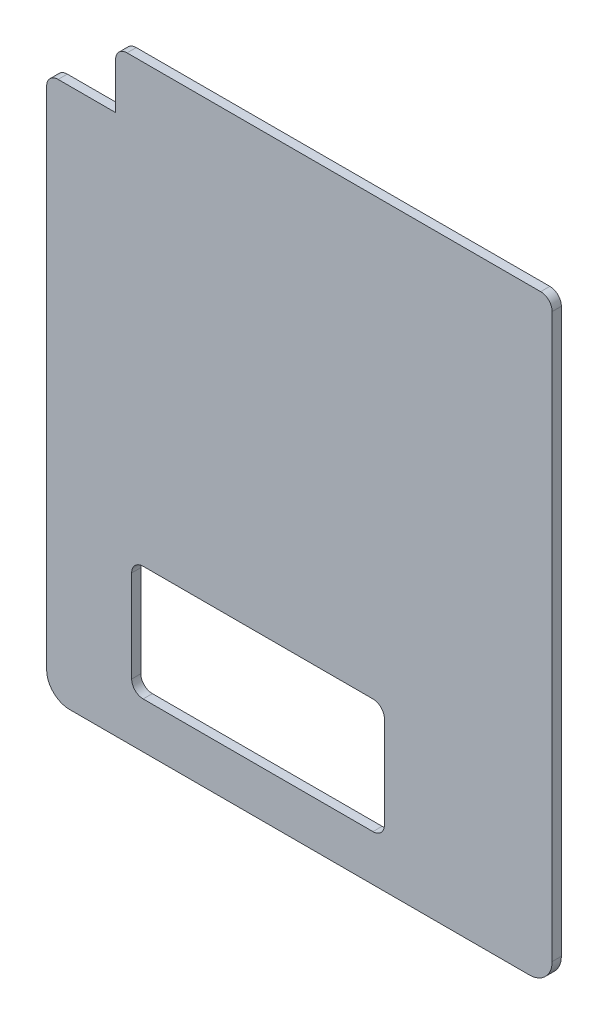
ISO-10303-21;
HEADER;
FILE_DESCRIPTION(('STEP AP214'),'2;1');
FILE_NAME('part.step','',(''),(''),'','','');
FILE_SCHEMA(('AUTOMOTIVE_DESIGN { 1 0 10303 214 1 1 1 1 }'));
ENDSEC;
DATA;
#1=APPLICATION_CONTEXT('core data for automotive mechanical design processes');
#2=APPLICATION_PROTOCOL_DEFINITION('international standard','automotive_design',2000,#1);
#3=PRODUCT_CONTEXT('',#1,'mechanical');
#4=PRODUCT('Part','Part','',(#3));
#5=PRODUCT_RELATED_PRODUCT_CATEGORY('part','',(#4));
#6=PRODUCT_DEFINITION_FORMATION('','',#4);
#7=PRODUCT_DEFINITION_CONTEXT('part definition',#1,'design');
#8=PRODUCT_DEFINITION('design','',#6,#7);
#9=PRODUCT_DEFINITION_SHAPE('','',#8);
#10=(LENGTH_UNIT() NAMED_UNIT(*) SI_UNIT(.MILLI.,.METRE.));
#11=(NAMED_UNIT(*) PLANE_ANGLE_UNIT() SI_UNIT($,.RADIAN.));
#12=(NAMED_UNIT(*) SI_UNIT($,.STERADIAN.) SOLID_ANGLE_UNIT());
#13=UNCERTAINTY_MEASURE_WITH_UNIT(LENGTH_MEASURE(1.E-05),#10,'distance_accuracy_value','');
#14=(GEOMETRIC_REPRESENTATION_CONTEXT(3) GLOBAL_UNCERTAINTY_ASSIGNED_CONTEXT((#13)) GLOBAL_UNIT_ASSIGNED_CONTEXT((#10,
#11,#12)) REPRESENTATION_CONTEXT('',''));
#15=CARTESIAN_POINT('',(0.,0.,0.));
#16=DIRECTION('',(0.,0.,1.));
#17=DIRECTION('',(1.,0.,0.));
#18=AXIS2_PLACEMENT_3D('',#15,#16,#17);
#19=CARTESIAN_POINT('',(0.,0.,0.4));
#20=DIRECTION('',(0.,0.,1.));
#21=DIRECTION('',(1.,0.,0.));
#22=AXIS2_PLACEMENT_3D('',#19,#20,#21);
#23=PLANE('',#22);
#24=DIRECTION('',(1.,0.,0.));
#25=VECTOR('',#24,1.);
#26=CARTESIAN_POINT('',(-22.,-26.,0.4));
#27=LINE('',#26,#25);
#28=CARTESIAN_POINT('',(-21.,-26.,0.4));
#29=VERTEX_POINT('',#28);
#30=CARTESIAN_POINT('',(-1.,-26.,0.4));
#31=VERTEX_POINT('',#30);
#32=EDGE_CURVE('E195',#29,#31,#27,.T.);
#33=ORIENTED_EDGE('',*,*,#32,.T.);
#34=CARTESIAN_POINT('',(-1.,-25.,0.4));
#35=DIRECTION('',(0.,0.,1.));
#36=DIRECTION('',(1.,0.,0.));
#37=AXIS2_PLACEMENT_3D('',#34,#35,#36);
#38=CIRCLE('',#37,1.);
#39=CARTESIAN_POINT('',(0.,-25.,0.4));
#40=VERTEX_POINT('',#39);
#41=EDGE_CURVE('E47',#31,#40,#38,.T.);
#42=ORIENTED_EDGE('',*,*,#41,.T.);
#43=DIRECTION('',(0.,1.,0.));
#44=VECTOR('',#43,1.);
#45=CARTESIAN_POINT('',(0.,-26.,0.4));
#46=LINE('',#45,#44);
#47=CARTESIAN_POINT('',(0.,-0.500000000000007,0.4));
#48=VERTEX_POINT('',#47);
#49=EDGE_CURVE('E218',#40,#48,#46,.T.);
#50=ORIENTED_EDGE('',*,*,#49,.T.);
#51=CARTESIAN_POINT('',(-0.5,-0.5,0.4));
#52=DIRECTION('',(0.,0.,1.));
#53=DIRECTION('',(1.,0.,0.));
#54=AXIS2_PLACEMENT_3D('',#51,#52,#53);
#55=CIRCLE('',#54,0.5);
#56=CARTESIAN_POINT('',(-0.5,0.,0.4));
#57=VERTEX_POINT('',#56);
#58=EDGE_CURVE('E252',#48,#57,#55,.T.);
#59=ORIENTED_EDGE('',*,*,#58,.T.);
#60=DIRECTION('',(-1.,0.,0.));
#61=VECTOR('',#60,1.);
#62=CARTESIAN_POINT('',(0.,0.,0.4));
#63=LINE('',#62,#61);
#64=CARTESIAN_POINT('',(-18.5,0.,0.4));
#65=VERTEX_POINT('',#64);
#66=EDGE_CURVE('E184',#57,#65,#63,.T.);
#67=ORIENTED_EDGE('',*,*,#66,.T.);
#68=CARTESIAN_POINT('',(-18.5,-0.500000000000002,0.4));
#69=DIRECTION('',(0.,0.,1.));
#70=DIRECTION('',(1.,0.,0.));
#71=AXIS2_PLACEMENT_3D('',#68,#69,#70);
#72=CIRCLE('',#71,0.5);
#73=CARTESIAN_POINT('',(-19.,-0.500000000000002,0.4));
#74=VERTEX_POINT('',#73);
#75=EDGE_CURVE('E180',#65,#74,#72,.T.);
#76=ORIENTED_EDGE('',*,*,#75,.T.);
#77=DIRECTION('',(0.,-1.,0.));
#78=VECTOR('',#77,1.);
#79=CARTESIAN_POINT('',(-19.,0.,0.4));
#80=LINE('',#79,#78);
#81=CARTESIAN_POINT('',(-19.,-2.5,0.4));
#82=VERTEX_POINT('',#81);
#83=EDGE_CURVE('E172',#74,#82,#80,.T.);
#84=ORIENTED_EDGE('',*,*,#83,.T.);
#85=DIRECTION('',(-1.,0.,0.));
#86=VECTOR('',#85,1.);
#87=CARTESIAN_POINT('',(-19.,-2.5,0.4));
#88=LINE('',#87,#86);
#89=CARTESIAN_POINT('',(-21.5,-2.5,0.4));
#90=VERTEX_POINT('',#89);
#91=EDGE_CURVE('E176',#82,#90,#88,.T.);
#92=ORIENTED_EDGE('',*,*,#91,.T.);
#93=CARTESIAN_POINT('',(-21.5,-3.,0.4));
#94=DIRECTION('',(0.,0.,1.));
#95=DIRECTION('',(1.,0.,0.));
#96=AXIS2_PLACEMENT_3D('',#93,#94,#95);
#97=CIRCLE('',#96,0.5);
#98=CARTESIAN_POINT('',(-22.,-3.,0.4));
#99=VERTEX_POINT('',#98);
#100=EDGE_CURVE('E250',#90,#99,#97,.T.);
#101=ORIENTED_EDGE('',*,*,#100,.T.);
#102=DIRECTION('',(0.,-1.,0.));
#103=VECTOR('',#102,1.);
#104=CARTESIAN_POINT('',(-22.,-2.5,0.4));
#105=LINE('',#104,#103);
#106=CARTESIAN_POINT('',(-22.,-25.,0.4));
#107=VERTEX_POINT('',#106);
#108=EDGE_CURVE('E200',#99,#107,#105,.T.);
#109=ORIENTED_EDGE('',*,*,#108,.T.);
#110=CARTESIAN_POINT('',(-21.,-25.,0.4));
#111=DIRECTION('',(0.,0.,1.));
#112=DIRECTION('',(1.,0.,0.));
#113=AXIS2_PLACEMENT_3D('',#110,#111,#112);
#114=CIRCLE('',#113,1.);
#115=EDGE_CURVE('E292',#107,#29,#114,.T.);
#116=ORIENTED_EDGE('',*,*,#115,.T.);
#117=EDGE_LOOP('',(#33,#42,#50,#59,#67,#76,#84,#92,#101,#109,#116));
#118=FACE_BOUND('',#117,.T.);
#119=DIRECTION('',(1.,0.,0.));
#120=VECTOR('',#119,1.);
#121=CARTESIAN_POINT('',(-18.3,-24.,0.4));
#122=LINE('',#121,#120);
#123=CARTESIAN_POINT('',(-17.8,-24.,0.4));
#124=VERTEX_POINT('',#123);
#125=CARTESIAN_POINT('',(-7.8,-24.,0.4));
#126=VERTEX_POINT('',#125);
#127=EDGE_CURVE('E394',#124,#126,#122,.T.);
#128=ORIENTED_EDGE('',*,*,#127,.F.);
#129=CARTESIAN_POINT('',(-17.8,-23.5,0.4));
#130=DIRECTION('',(0.,0.,1.));
#131=DIRECTION('',(1.,0.,0.));
#132=AXIS2_PLACEMENT_3D('',#129,#130,#131);
#133=CIRCLE('',#132,0.5);
#134=CARTESIAN_POINT('',(-18.3,-23.5,0.4));
#135=VERTEX_POINT('',#134);
#136=EDGE_CURVE('E267',#124,#135,#133,.F.);
#137=ORIENTED_EDGE('',*,*,#136,.T.);
#138=DIRECTION('',(0.,-1.,0.));
#139=VECTOR('',#138,1.);
#140=CARTESIAN_POINT('',(-18.3,-24.,0.4));
#141=LINE('',#140,#139);
#142=CARTESIAN_POINT('',(-18.3,-19.5,0.4));
#143=VERTEX_POINT('',#142);
#144=EDGE_CURVE('E379',#143,#135,#141,.T.);
#145=ORIENTED_EDGE('',*,*,#144,.F.);
#146=CARTESIAN_POINT('',(-17.8,-19.5,0.4));
#147=DIRECTION('',(0.,0.,1.));
#148=DIRECTION('',(1.,0.,0.));
#149=AXIS2_PLACEMENT_3D('',#146,#147,#148);
#150=CIRCLE('',#149,0.5);
#151=CARTESIAN_POINT('',(-17.8,-19.,0.4));
#152=VERTEX_POINT('',#151);
#153=EDGE_CURVE('E279',#143,#152,#150,.F.);
#154=ORIENTED_EDGE('',*,*,#153,.T.);
#155=DIRECTION('',(-1.,0.,0.));
#156=VECTOR('',#155,1.);
#157=CARTESIAN_POINT('',(-18.3,-19.,0.4));
#158=LINE('',#157,#156);
#159=CARTESIAN_POINT('',(-7.8,-19.,0.4));
#160=VERTEX_POINT('',#159);
#161=EDGE_CURVE('E209',#160,#152,#158,.T.);
#162=ORIENTED_EDGE('',*,*,#161,.F.);
#163=CARTESIAN_POINT('',(-7.8,-19.5,0.4));
#164=DIRECTION('',(0.,0.,1.));
#165=DIRECTION('',(1.,0.,0.));
#166=AXIS2_PLACEMENT_3D('',#163,#164,#165);
#167=CIRCLE('',#166,0.5);
#168=CARTESIAN_POINT('',(-7.3,-19.5,0.4));
#169=VERTEX_POINT('',#168);
#170=EDGE_CURVE('E275',#160,#169,#167,.F.);
#171=ORIENTED_EDGE('',*,*,#170,.T.);
#172=DIRECTION('',(0.,1.,0.));
#173=VECTOR('',#172,1.);
#174=CARTESIAN_POINT('',(-7.3,-24.,0.4));
#175=LINE('',#174,#173);
#176=CARTESIAN_POINT('',(-7.3,-23.5,0.4));
#177=VERTEX_POINT('',#176);
#178=EDGE_CURVE('E391',#177,#169,#175,.T.);
#179=ORIENTED_EDGE('',*,*,#178,.F.);
#180=CARTESIAN_POINT('',(-7.8,-23.5,0.4));
#181=DIRECTION('',(0.,0.,1.));
#182=DIRECTION('',(1.,0.,0.));
#183=AXIS2_PLACEMENT_3D('',#180,#181,#182);
#184=CIRCLE('',#183,0.5);
#185=EDGE_CURVE('E271',#177,#126,#184,.F.);
#186=ORIENTED_EDGE('',*,*,#185,.T.);
#187=EDGE_LOOP('',(#128,#137,#145,#154,#162,#171,#179,#186));
#188=FACE_BOUND('',#187,.T.);
#189=ADVANCED_FACE('F39',(#118,#188),#23,.T.);
#190=CARTESIAN_POINT('',(0.,0.,0.));
#191=DIRECTION('',(0.,0.,1.));
#192=DIRECTION('',(1.,0.,0.));
#193=AXIS2_PLACEMENT_3D('',#190,#191,#192);
#194=PLANE('',#193);
#195=DIRECTION('',(0.,1.,0.));
#196=VECTOR('',#195,1.);
#197=CARTESIAN_POINT('',(0.,-26.,0.));
#198=LINE('',#197,#196);
#199=CARTESIAN_POINT('',(0.,-25.,0.));
#200=VERTEX_POINT('',#199);
#201=CARTESIAN_POINT('',(0.,-0.500000000000007,0.));
#202=VERTEX_POINT('',#201);
#203=EDGE_CURVE('E206',#200,#202,#198,.T.);
#204=ORIENTED_EDGE('',*,*,#203,.F.);
#205=CARTESIAN_POINT('',(-1.,-25.,0.));
#206=DIRECTION('',(0.,0.,1.));
#207=DIRECTION('',(1.,0.,0.));
#208=AXIS2_PLACEMENT_3D('',#205,#206,#207);
#209=CIRCLE('',#208,1.);
#210=CARTESIAN_POINT('',(-1.,-26.,0.));
#211=VERTEX_POINT('',#210);
#212=EDGE_CURVE('E286',#200,#211,#209,.F.);
#213=ORIENTED_EDGE('',*,*,#212,.T.);
#214=DIRECTION('',(1.,0.,0.));
#215=VECTOR('',#214,1.);
#216=CARTESIAN_POINT('',(-22.,-26.,0.));
#217=LINE('',#216,#215);
#218=CARTESIAN_POINT('',(-21.,-26.,0.));
#219=VERTEX_POINT('',#218);
#220=EDGE_CURVE('E217',#219,#211,#217,.T.);
#221=ORIENTED_EDGE('',*,*,#220,.F.);
#222=CARTESIAN_POINT('',(-21.,-25.,0.));
#223=DIRECTION('',(0.,0.,1.));
#224=DIRECTION('',(1.,0.,0.));
#225=AXIS2_PLACEMENT_3D('',#222,#223,#224);
#226=CIRCLE('',#225,1.);
#227=CARTESIAN_POINT('',(-22.,-25.,0.));
#228=VERTEX_POINT('',#227);
#229=EDGE_CURVE('E284',#219,#228,#226,.F.);
#230=ORIENTED_EDGE('',*,*,#229,.T.);
#231=DIRECTION('',(0.,-1.,0.));
#232=VECTOR('',#231,1.);
#233=CARTESIAN_POINT('',(-22.,-2.5,0.));
#234=LINE('',#233,#232);
#235=CARTESIAN_POINT('',(-22.,-3.,0.));
#236=VERTEX_POINT('',#235);
#237=EDGE_CURVE('E215',#236,#228,#234,.T.);
#238=ORIENTED_EDGE('',*,*,#237,.F.);
#239=CARTESIAN_POINT('',(-21.5,-3.,0.));
#240=DIRECTION('',(0.,0.,1.));
#241=DIRECTION('',(1.,0.,0.));
#242=AXIS2_PLACEMENT_3D('',#239,#240,#241);
#243=CIRCLE('',#242,0.5);
#244=CARTESIAN_POINT('',(-21.5,-2.5,0.));
#245=VERTEX_POINT('',#244);
#246=EDGE_CURVE('E241',#236,#245,#243,.F.);
#247=ORIENTED_EDGE('',*,*,#246,.T.);
#248=DIRECTION('',(-1.,0.,0.));
#249=VECTOR('',#248,1.);
#250=CARTESIAN_POINT('',(-19.,-2.5,0.));
#251=LINE('',#250,#249);
#252=CARTESIAN_POINT('',(-19.,-2.5,0.));
#253=VERTEX_POINT('',#252);
#254=EDGE_CURVE('E213',#253,#245,#251,.T.);
#255=ORIENTED_EDGE('',*,*,#254,.F.);
#256=DIRECTION('',(0.,-1.,0.));
#257=VECTOR('',#256,1.);
#258=CARTESIAN_POINT('',(-19.,0.,0.));
#259=LINE('',#258,#257);
#260=CARTESIAN_POINT('',(-19.,-0.500000000000002,0.));
#261=VERTEX_POINT('',#260);
#262=EDGE_CURVE('E190',#261,#253,#259,.T.);
#263=ORIENTED_EDGE('',*,*,#262,.F.);
#264=CARTESIAN_POINT('',(-18.5,-0.500000000000002,0.));
#265=DIRECTION('',(0.,0.,1.));
#266=DIRECTION('',(1.,0.,0.));
#267=AXIS2_PLACEMENT_3D('',#264,#265,#266);
#268=CIRCLE('',#267,0.5);
#269=CARTESIAN_POINT('',(-18.5,0.,0.));
#270=VERTEX_POINT('',#269);
#271=EDGE_CURVE('E239',#261,#270,#268,.F.);
#272=ORIENTED_EDGE('',*,*,#271,.T.);
#273=DIRECTION('',(-1.,0.,0.));
#274=VECTOR('',#273,1.);
#275=CARTESIAN_POINT('',(0.,0.,0.));
#276=LINE('',#275,#274);
#277=CARTESIAN_POINT('',(-0.5,0.,0.));
#278=VERTEX_POINT('',#277);
#279=EDGE_CURVE('E208',#278,#270,#276,.T.);
#280=ORIENTED_EDGE('',*,*,#279,.F.);
#281=CARTESIAN_POINT('',(-0.5,-0.5,0.));
#282=DIRECTION('',(0.,0.,1.));
#283=DIRECTION('',(1.,0.,0.));
#284=AXIS2_PLACEMENT_3D('',#281,#282,#283);
#285=CIRCLE('',#284,0.5);
#286=EDGE_CURVE('E243',#278,#202,#285,.F.);
#287=ORIENTED_EDGE('',*,*,#286,.T.);
#288=EDGE_LOOP('',(#204,#213,#221,#230,#238,#247,#255,#263,#272,#280,#287));
#289=FACE_BOUND('',#288,.T.);
#290=DIRECTION('',(-1.,0.,0.));
#291=VECTOR('',#290,1.);
#292=CARTESIAN_POINT('',(-18.3,-19.,0.));
#293=LINE('',#292,#291);
#294=CARTESIAN_POINT('',(-7.8,-19.,0.));
#295=VERTEX_POINT('',#294);
#296=CARTESIAN_POINT('',(-17.8,-19.,0.));
#297=VERTEX_POINT('',#296);
#298=EDGE_CURVE('E376',#295,#297,#293,.T.);
#299=ORIENTED_EDGE('',*,*,#298,.T.);
#300=CARTESIAN_POINT('',(-17.8,-19.5,0.));
#301=DIRECTION('',(0.,0.,1.));
#302=DIRECTION('',(1.,0.,0.));
#303=AXIS2_PLACEMENT_3D('',#300,#301,#302);
#304=CIRCLE('',#303,0.5);
#305=CARTESIAN_POINT('',(-18.3,-19.5,0.));
#306=VERTEX_POINT('',#305);
#307=EDGE_CURVE('E277',#297,#306,#304,.T.);
#308=ORIENTED_EDGE('',*,*,#307,.T.);
#309=DIRECTION('',(0.,-1.,0.));
#310=VECTOR('',#309,1.);
#311=CARTESIAN_POINT('',(-18.3,-24.,0.));
#312=LINE('',#311,#310);
#313=CARTESIAN_POINT('',(-18.3,-23.5,0.));
#314=VERTEX_POINT('',#313);
#315=EDGE_CURVE('E386',#306,#314,#312,.T.);
#316=ORIENTED_EDGE('',*,*,#315,.T.);
#317=CARTESIAN_POINT('',(-17.8,-23.5,0.));
#318=DIRECTION('',(0.,0.,1.));
#319=DIRECTION('',(1.,0.,0.));
#320=AXIS2_PLACEMENT_3D('',#317,#318,#319);
#321=CIRCLE('',#320,0.5);
#322=CARTESIAN_POINT('',(-17.8,-24.,0.));
#323=VERTEX_POINT('',#322);
#324=EDGE_CURVE('E265',#314,#323,#321,.T.);
#325=ORIENTED_EDGE('',*,*,#324,.T.);
#326=DIRECTION('',(1.,0.,0.));
#327=VECTOR('',#326,1.);
#328=CARTESIAN_POINT('',(-18.3,-24.,0.));
#329=LINE('',#328,#327);
#330=CARTESIAN_POINT('',(-7.8,-24.,0.));
#331=VERTEX_POINT('',#330);
#332=EDGE_CURVE('E383',#323,#331,#329,.T.);
#333=ORIENTED_EDGE('',*,*,#332,.T.);
#334=CARTESIAN_POINT('',(-7.8,-23.5,0.));
#335=DIRECTION('',(0.,0.,1.));
#336=DIRECTION('',(1.,0.,0.));
#337=AXIS2_PLACEMENT_3D('',#334,#335,#336);
#338=CIRCLE('',#337,0.5);
#339=CARTESIAN_POINT('',(-7.3,-23.5,0.));
#340=VERTEX_POINT('',#339);
#341=EDGE_CURVE('E269',#331,#340,#338,.T.);
#342=ORIENTED_EDGE('',*,*,#341,.T.);
#343=DIRECTION('',(0.,1.,0.));
#344=VECTOR('',#343,1.);
#345=CARTESIAN_POINT('',(-7.3,-24.,0.));
#346=LINE('',#345,#344);
#347=CARTESIAN_POINT('',(-7.3,-19.5,0.));
#348=VERTEX_POINT('',#347);
#349=EDGE_CURVE('E380',#340,#348,#346,.T.);
#350=ORIENTED_EDGE('',*,*,#349,.T.);
#351=CARTESIAN_POINT('',(-7.8,-19.5,0.));
#352=DIRECTION('',(0.,0.,1.));
#353=DIRECTION('',(1.,0.,0.));
#354=AXIS2_PLACEMENT_3D('',#351,#352,#353);
#355=CIRCLE('',#354,0.5);
#356=EDGE_CURVE('E273',#348,#295,#355,.T.);
#357=ORIENTED_EDGE('',*,*,#356,.T.);
#358=EDGE_LOOP('',(#299,#308,#316,#325,#333,#342,#350,#357));
#359=FACE_BOUND('',#358,.T.);
#360=ADVANCED_FACE('F306',(#289,#359),#194,.F.);
#361=CARTESIAN_POINT('',(0.,-26.,0.4));
#362=DIRECTION('',(-1.,0.,0.));
#363=DIRECTION('',(0.,0.,1.));
#364=AXIS2_PLACEMENT_3D('',#361,#362,#363);
#365=PLANE('',#364);
#366=ORIENTED_EDGE('',*,*,#49,.F.);
#367=DIRECTION('',(0.,0.,-1.));
#368=VECTOR('',#367,1.);
#369=CARTESIAN_POINT('',(0.,-25.,0.4));
#370=LINE('',#369,#368);
#371=EDGE_CURVE('E281',#40,#200,#370,.T.);
#372=ORIENTED_EDGE('',*,*,#371,.T.);
#373=ORIENTED_EDGE('',*,*,#203,.T.);
#374=DIRECTION('',(0.,0.,-1.));
#375=VECTOR('',#374,1.);
#376=CARTESIAN_POINT('',(0.,-0.5,0.4));
#377=LINE('',#376,#375);
#378=EDGE_CURVE('E246',#202,#48,#377,.F.);
#379=ORIENTED_EDGE('',*,*,#378,.T.);
#380=EDGE_LOOP('',(#366,#372,#373,#379));
#381=FACE_BOUND('',#380,.T.);
#382=ADVANCED_FACE('F298',(#381),#365,.F.);
#383=CARTESIAN_POINT('',(0.,0.,0.4));
#384=DIRECTION('',(0.,-1.,0.));
#385=DIRECTION('',(1.,0.,0.));
#386=AXIS2_PLACEMENT_3D('',#383,#384,#385);
#387=PLANE('',#386);
#388=ORIENTED_EDGE('',*,*,#66,.F.);
#389=DIRECTION('',(0.,0.,-1.));
#390=VECTOR('',#389,1.);
#391=CARTESIAN_POINT('',(-0.5,0.,0.4));
#392=LINE('',#391,#390);
#393=EDGE_CURVE('E236',#57,#278,#392,.T.);
#394=ORIENTED_EDGE('',*,*,#393,.T.);
#395=ORIENTED_EDGE('',*,*,#279,.T.);
#396=DIRECTION('',(0.,0.,-1.));
#397=VECTOR('',#396,1.);
#398=CARTESIAN_POINT('',(-18.5,0.,0.4));
#399=LINE('',#398,#397);
#400=EDGE_CURVE('E234',#270,#65,#399,.F.);
#401=ORIENTED_EDGE('',*,*,#400,.T.);
#402=EDGE_LOOP('',(#388,#394,#395,#401));
#403=FACE_BOUND('',#402,.T.);
#404=ADVANCED_FACE('F322',(#403),#387,.F.);
#405=CARTESIAN_POINT('',(-19.,0.,0.4));
#406=DIRECTION('',(1.,0.,0.));
#407=DIRECTION('',(0.,0.,-1.));
#408=AXIS2_PLACEMENT_3D('',#405,#406,#407);
#409=PLANE('',#408);
#410=ORIENTED_EDGE('',*,*,#83,.F.);
#411=DIRECTION('',(0.,0.,-1.));
#412=VECTOR('',#411,1.);
#413=CARTESIAN_POINT('',(-19.,-0.500000000000002,0.4));
#414=LINE('',#413,#412);
#415=EDGE_CURVE('E258',#74,#261,#414,.T.);
#416=ORIENTED_EDGE('',*,*,#415,.T.);
#417=ORIENTED_EDGE('',*,*,#262,.T.);
#418=DIRECTION('',(0.,0.,-1.));
#419=VECTOR('',#418,1.);
#420=CARTESIAN_POINT('',(-19.,-2.5,0.4));
#421=LINE('',#420,#419);
#422=EDGE_CURVE('E187',#82,#253,#421,.T.);
#423=ORIENTED_EDGE('',*,*,#422,.F.);
#424=EDGE_LOOP('',(#410,#416,#417,#423));
#425=FACE_BOUND('',#424,.T.);
#426=ADVANCED_FACE('F188',(#425),#409,.F.);
#427=CARTESIAN_POINT('',(-19.,-2.5,0.4));
#428=DIRECTION('',(0.,-1.,0.));
#429=DIRECTION('',(1.,0.,0.));
#430=AXIS2_PLACEMENT_3D('',#427,#428,#429);
#431=PLANE('',#430);
#432=ORIENTED_EDGE('',*,*,#254,.T.);
#433=DIRECTION('',(0.,0.,-1.));
#434=VECTOR('',#433,1.);
#435=CARTESIAN_POINT('',(-21.5,-2.5,0.4));
#436=LINE('',#435,#434);
#437=EDGE_CURVE('E199',#245,#90,#436,.F.);
#438=ORIENTED_EDGE('',*,*,#437,.T.);
#439=ORIENTED_EDGE('',*,*,#91,.F.);
#440=ORIENTED_EDGE('',*,*,#422,.T.);
#441=EDGE_LOOP('',(#432,#438,#439,#440));
#442=FACE_BOUND('',#441,.T.);
#443=ADVANCED_FACE('F197',(#442),#431,.F.);
#444=CARTESIAN_POINT('',(-22.,-2.5,0.4));
#445=DIRECTION('',(1.,0.,0.));
#446=DIRECTION('',(0.,1.,0.));
#447=AXIS2_PLACEMENT_3D('',#444,#445,#446);
#448=PLANE('',#447);
#449=ORIENTED_EDGE('',*,*,#237,.T.);
#450=DIRECTION('',(0.,0.,-1.));
#451=VECTOR('',#450,1.);
#452=CARTESIAN_POINT('',(-22.,-25.,0.4));
#453=LINE('',#452,#451);
#454=EDGE_CURVE('E11',#228,#107,#453,.F.);
#455=ORIENTED_EDGE('',*,*,#454,.T.);
#456=ORIENTED_EDGE('',*,*,#108,.F.);
#457=DIRECTION('',(0.,0.,-1.));
#458=VECTOR('',#457,1.);
#459=CARTESIAN_POINT('',(-22.,-3.,0.4));
#460=LINE('',#459,#458);
#461=EDGE_CURVE('E254',#99,#236,#460,.T.);
#462=ORIENTED_EDGE('',*,*,#461,.T.);
#463=EDGE_LOOP('',(#449,#455,#456,#462));
#464=FACE_BOUND('',#463,.T.);
#465=ADVANCED_FACE('F313',(#464),#448,.F.);
#466=CARTESIAN_POINT('',(-22.,-26.,0.4));
#467=DIRECTION('',(0.,1.,0.));
#468=DIRECTION('',(0.,0.,1.));
#469=AXIS2_PLACEMENT_3D('',#466,#467,#468);
#470=PLANE('',#469);
#471=ORIENTED_EDGE('',*,*,#220,.T.);
#472=DIRECTION('',(0.,0.,-1.));
#473=VECTOR('',#472,1.);
#474=CARTESIAN_POINT('',(-1.,-26.,0.4));
#475=LINE('',#474,#473);
#476=EDGE_CURVE('E60',#211,#31,#475,.F.);
#477=ORIENTED_EDGE('',*,*,#476,.T.);
#478=ORIENTED_EDGE('',*,*,#32,.F.);
#479=DIRECTION('',(0.,0.,-1.));
#480=VECTOR('',#479,1.);
#481=CARTESIAN_POINT('',(-21.,-26.,0.4));
#482=LINE('',#481,#480);
#483=EDGE_CURVE('E288',#29,#219,#482,.T.);
#484=ORIENTED_EDGE('',*,*,#483,.T.);
#485=EDGE_LOOP('',(#471,#477,#478,#484));
#486=FACE_BOUND('',#485,.T.);
#487=ADVANCED_FACE('F308',(#486),#470,.F.);
#488=CARTESIAN_POINT('',(-18.3,-24.,0.4));
#489=DIRECTION('',(1.,0.,0.));
#490=DIRECTION('',(0.,1.,0.));
#491=AXIS2_PLACEMENT_3D('',#488,#489,#490);
#492=PLANE('',#491);
#493=ORIENTED_EDGE('',*,*,#144,.T.);
#494=DIRECTION('',(0.,0.,-1.));
#495=VECTOR('',#494,1.);
#496=CARTESIAN_POINT('',(-18.3,-23.5,0.));
#497=LINE('',#496,#495);
#498=EDGE_CURVE('E221',#135,#314,#497,.T.);
#499=ORIENTED_EDGE('',*,*,#498,.T.);
#500=ORIENTED_EDGE('',*,*,#315,.F.);
#501=DIRECTION('',(0.,0.,-1.));
#502=VECTOR('',#501,1.);
#503=CARTESIAN_POINT('',(-18.3,-19.5,0.4));
#504=LINE('',#503,#502);
#505=EDGE_CURVE('E194',#306,#143,#504,.F.);
#506=ORIENTED_EDGE('',*,*,#505,.T.);
#507=EDGE_LOOP('',(#493,#499,#500,#506));
#508=FACE_BOUND('',#507,.T.);
#509=ADVANCED_FACE('F346',(#508),#492,.T.);
#510=CARTESIAN_POINT('',(-18.3,-24.,0.4));
#511=DIRECTION('',(0.,1.,0.));
#512=DIRECTION('',(0.,0.,1.));
#513=AXIS2_PLACEMENT_3D('',#510,#511,#512);
#514=PLANE('',#513);
#515=ORIENTED_EDGE('',*,*,#332,.F.);
#516=DIRECTION('',(0.,0.,-1.));
#517=VECTOR('',#516,1.);
#518=CARTESIAN_POINT('',(-17.8,-24.,0.4));
#519=LINE('',#518,#517);
#520=EDGE_CURVE('E227',#323,#124,#519,.F.);
#521=ORIENTED_EDGE('',*,*,#520,.T.);
#522=ORIENTED_EDGE('',*,*,#127,.T.);
#523=DIRECTION('',(0.,0.,-1.));
#524=VECTOR('',#523,1.);
#525=CARTESIAN_POINT('',(-7.8,-24.,0.));
#526=LINE('',#525,#524);
#527=EDGE_CURVE('E224',#126,#331,#526,.T.);
#528=ORIENTED_EDGE('',*,*,#527,.T.);
#529=EDGE_LOOP('',(#515,#521,#522,#528));
#530=FACE_BOUND('',#529,.T.);
#531=ADVANCED_FACE('F408',(#530),#514,.T.);
#532=CARTESIAN_POINT('',(-7.3,-24.,0.4));
#533=DIRECTION('',(-1.,0.,0.));
#534=DIRECTION('',(0.,0.,1.));
#535=AXIS2_PLACEMENT_3D('',#532,#533,#534);
#536=PLANE('',#535);
#537=ORIENTED_EDGE('',*,*,#349,.F.);
#538=DIRECTION('',(0.,0.,-1.));
#539=VECTOR('',#538,1.);
#540=CARTESIAN_POINT('',(-7.3,-23.5,0.4));
#541=LINE('',#540,#539);
#542=EDGE_CURVE('E232',#340,#177,#541,.F.);
#543=ORIENTED_EDGE('',*,*,#542,.T.);
#544=ORIENTED_EDGE('',*,*,#178,.T.);
#545=DIRECTION('',(0.,0.,-1.));
#546=VECTOR('',#545,1.);
#547=CARTESIAN_POINT('',(-7.3,-19.5,0.));
#548=LINE('',#547,#546);
#549=EDGE_CURVE('E229',#169,#348,#548,.T.);
#550=ORIENTED_EDGE('',*,*,#549,.T.);
#551=EDGE_LOOP('',(#537,#543,#544,#550));
#552=FACE_BOUND('',#551,.T.);
#553=ADVANCED_FACE('F415',(#552),#536,.T.);
#554=CARTESIAN_POINT('',(-18.3,-19.,0.4));
#555=DIRECTION('',(0.,-1.,0.));
#556=DIRECTION('',(0.,0.,-1.));
#557=AXIS2_PLACEMENT_3D('',#554,#555,#556);
#558=PLANE('',#557);
#559=ORIENTED_EDGE('',*,*,#298,.F.);
#560=DIRECTION('',(0.,0.,-1.));
#561=VECTOR('',#560,1.);
#562=CARTESIAN_POINT('',(-7.8,-19.,0.4));
#563=LINE('',#562,#561);
#564=EDGE_CURVE('E263',#295,#160,#563,.F.);
#565=ORIENTED_EDGE('',*,*,#564,.T.);
#566=ORIENTED_EDGE('',*,*,#161,.T.);
#567=DIRECTION('',(0.,0.,-1.));
#568=VECTOR('',#567,1.);
#569=CARTESIAN_POINT('',(-17.8,-19.,0.));
#570=LINE('',#569,#568);
#571=EDGE_CURVE('E260',#152,#297,#570,.T.);
#572=ORIENTED_EDGE('',*,*,#571,.T.);
#573=EDGE_LOOP('',(#559,#565,#566,#572));
#574=FACE_BOUND('',#573,.T.);
#575=ADVANCED_FACE('F365',(#574),#558,.T.);
#576=CARTESIAN_POINT('',(-17.8,-23.5,0.4));
#577=DIRECTION('',(0.,0.,1.));
#578=DIRECTION('',(1.,0.,0.));
#579=AXIS2_PLACEMENT_3D('',#576,#577,#578);
#580=CYLINDRICAL_SURFACE('',#579,0.5);
#581=ORIENTED_EDGE('',*,*,#136,.F.);
#582=ORIENTED_EDGE('',*,*,#520,.F.);
#583=ORIENTED_EDGE('',*,*,#324,.F.);
#584=ORIENTED_EDGE('',*,*,#498,.F.);
#585=EDGE_LOOP('',(#581,#582,#583,#584));
#586=FACE_BOUND('',#585,.T.);
#587=ADVANCED_FACE('F361',(#586),#580,.F.);
#588=CARTESIAN_POINT('',(-7.8,-23.5,0.4));
#589=DIRECTION('',(0.,0.,1.));
#590=DIRECTION('',(1.,0.,0.));
#591=AXIS2_PLACEMENT_3D('',#588,#589,#590);
#592=CYLINDRICAL_SURFACE('',#591,0.5);
#593=ORIENTED_EDGE('',*,*,#185,.F.);
#594=ORIENTED_EDGE('',*,*,#542,.F.);
#595=ORIENTED_EDGE('',*,*,#341,.F.);
#596=ORIENTED_EDGE('',*,*,#527,.F.);
#597=EDGE_LOOP('',(#593,#594,#595,#596));
#598=FACE_BOUND('',#597,.T.);
#599=ADVANCED_FACE('F364',(#598),#592,.F.);
#600=CARTESIAN_POINT('',(-0.5,-0.5,0.4));
#601=DIRECTION('',(0.,0.,-1.));
#602=DIRECTION('',(-1.,0.,0.));
#603=AXIS2_PLACEMENT_3D('',#600,#601,#602);
#604=CYLINDRICAL_SURFACE('',#603,0.5);
#605=ORIENTED_EDGE('',*,*,#58,.F.);
#606=ORIENTED_EDGE('',*,*,#378,.F.);
#607=ORIENTED_EDGE('',*,*,#286,.F.);
#608=ORIENTED_EDGE('',*,*,#393,.F.);
#609=EDGE_LOOP('',(#605,#606,#607,#608));
#610=FACE_BOUND('',#609,.T.);
#611=ADVANCED_FACE('F335',(#610),#604,.T.);
#612=CARTESIAN_POINT('',(-21.5,-3.,0.4));
#613=DIRECTION('',(0.,0.,-1.));
#614=DIRECTION('',(-1.,0.,0.));
#615=AXIS2_PLACEMENT_3D('',#612,#613,#614);
#616=CYLINDRICAL_SURFACE('',#615,0.5);
#617=ORIENTED_EDGE('',*,*,#100,.F.);
#618=ORIENTED_EDGE('',*,*,#437,.F.);
#619=ORIENTED_EDGE('',*,*,#246,.F.);
#620=ORIENTED_EDGE('',*,*,#461,.F.);
#621=EDGE_LOOP('',(#617,#618,#619,#620));
#622=FACE_BOUND('',#621,.T.);
#623=ADVANCED_FACE('F316',(#622),#616,.T.);
#624=CARTESIAN_POINT('',(-18.5,-0.500000000000002,0.4));
#625=DIRECTION('',(0.,0.,-1.));
#626=DIRECTION('',(-1.,0.,0.));
#627=AXIS2_PLACEMENT_3D('',#624,#625,#626);
#628=CYLINDRICAL_SURFACE('',#627,0.5);
#629=ORIENTED_EDGE('',*,*,#75,.F.);
#630=ORIENTED_EDGE('',*,*,#400,.F.);
#631=ORIENTED_EDGE('',*,*,#271,.F.);
#632=ORIENTED_EDGE('',*,*,#415,.F.);
#633=EDGE_LOOP('',(#629,#630,#631,#632));
#634=FACE_BOUND('',#633,.T.);
#635=ADVANCED_FACE('F324',(#634),#628,.T.);
#636=CARTESIAN_POINT('',(-7.8,-19.5,0.4));
#637=DIRECTION('',(0.,0.,1.));
#638=DIRECTION('',(1.,0.,0.));
#639=AXIS2_PLACEMENT_3D('',#636,#637,#638);
#640=CYLINDRICAL_SURFACE('',#639,0.5);
#641=ORIENTED_EDGE('',*,*,#170,.F.);
#642=ORIENTED_EDGE('',*,*,#564,.F.);
#643=ORIENTED_EDGE('',*,*,#356,.F.);
#644=ORIENTED_EDGE('',*,*,#549,.F.);
#645=EDGE_LOOP('',(#641,#642,#643,#644));
#646=FACE_BOUND('',#645,.T.);
#647=ADVANCED_FACE('F326',(#646),#640,.F.);
#648=CARTESIAN_POINT('',(-17.8,-19.5,0.4));
#649=DIRECTION('',(0.,0.,1.));
#650=DIRECTION('',(1.,0.,0.));
#651=AXIS2_PLACEMENT_3D('',#648,#649,#650);
#652=CYLINDRICAL_SURFACE('',#651,0.5);
#653=ORIENTED_EDGE('',*,*,#153,.F.);
#654=ORIENTED_EDGE('',*,*,#505,.F.);
#655=ORIENTED_EDGE('',*,*,#307,.F.);
#656=ORIENTED_EDGE('',*,*,#571,.F.);
#657=EDGE_LOOP('',(#653,#654,#655,#656));
#658=FACE_BOUND('',#657,.T.);
#659=ADVANCED_FACE('F331',(#658),#652,.F.);
#660=CARTESIAN_POINT('',(-1.,-25.,0.4));
#661=DIRECTION('',(0.,0.,-1.));
#662=DIRECTION('',(-1.,0.,0.));
#663=AXIS2_PLACEMENT_3D('',#660,#661,#662);
#664=CYLINDRICAL_SURFACE('',#663,1.);
#665=ORIENTED_EDGE('',*,*,#41,.F.);
#666=ORIENTED_EDGE('',*,*,#476,.F.);
#667=ORIENTED_EDGE('',*,*,#212,.F.);
#668=ORIENTED_EDGE('',*,*,#371,.F.);
#669=EDGE_LOOP('',(#665,#666,#667,#668));
#670=FACE_BOUND('',#669,.T.);
#671=ADVANCED_FACE('F303',(#670),#664,.T.);
#672=CARTESIAN_POINT('',(-21.,-25.,0.4));
#673=DIRECTION('',(0.,0.,-1.));
#674=DIRECTION('',(-1.,0.,0.));
#675=AXIS2_PLACEMENT_3D('',#672,#673,#674);
#676=CYLINDRICAL_SURFACE('',#675,1.);
#677=ORIENTED_EDGE('',*,*,#115,.F.);
#678=ORIENTED_EDGE('',*,*,#454,.F.);
#679=ORIENTED_EDGE('',*,*,#229,.F.);
#680=ORIENTED_EDGE('',*,*,#483,.F.);
#681=EDGE_LOOP('',(#677,#678,#679,#680));
#682=FACE_BOUND('',#681,.T.);
#683=ADVANCED_FACE('F41',(#682),#676,.T.);
#684=CLOSED_SHELL('',(#189,#360,#382,#404,#426,#443,#465,#487,#509,#531,#553,#575,#587,#599,
#611,#623,#635,#647,#659,#671,#683));
#685=MANIFOLD_SOLID_BREP('B2',#684);
#686=ADVANCED_BREP_SHAPE_REPRESENTATION('',(#18,#685),#14);
#687=SHAPE_DEFINITION_REPRESENTATION(#9,#686);
ENDSEC;
END-ISO-10303-21;
